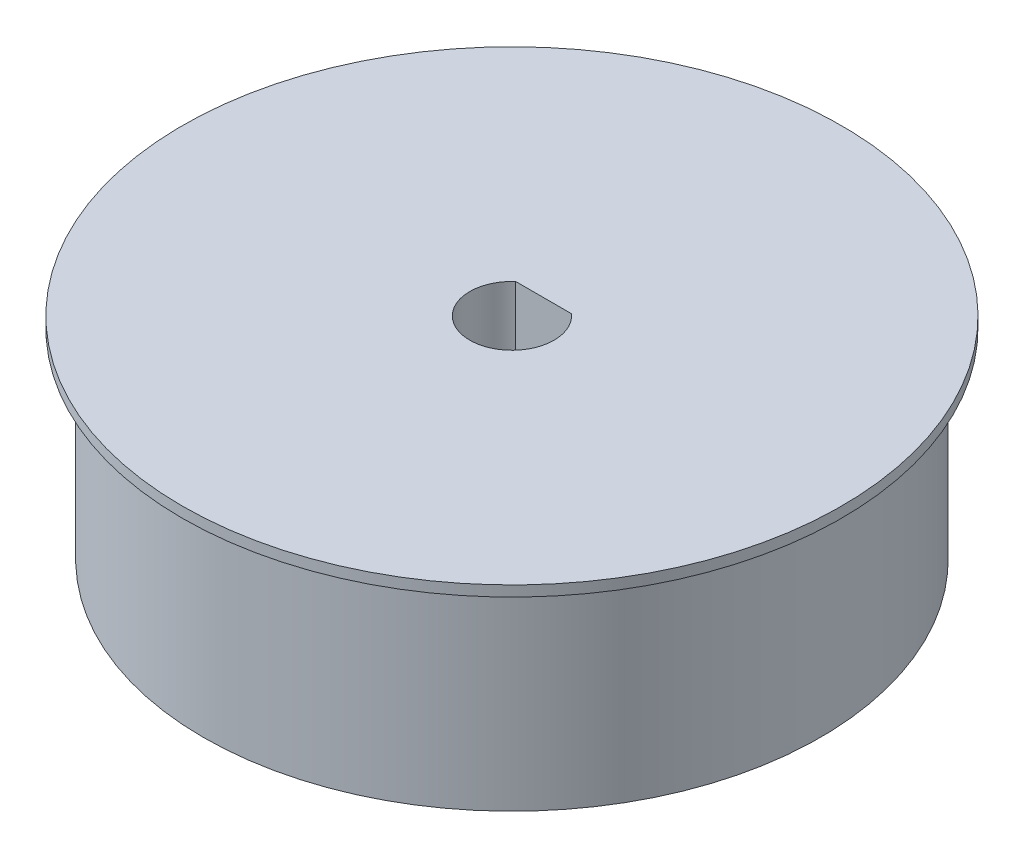
ISO-10303-21;
HEADER;
FILE_DESCRIPTION(('STEP AP214'),'2;1');
FILE_NAME('part.step','',(''),(''),'','','');
FILE_SCHEMA(('AUTOMOTIVE_DESIGN { 1 0 10303 214 1 1 1 1 }'));
ENDSEC;
DATA;
#1=APPLICATION_CONTEXT('core data for automotive mechanical design processes');
#2=APPLICATION_PROTOCOL_DEFINITION('international standard','automotive_design',2000,#1);
#3=PRODUCT_CONTEXT('',#1,'mechanical');
#4=PRODUCT('Part','Part','',(#3));
#5=PRODUCT_RELATED_PRODUCT_CATEGORY('part','',(#4));
#6=PRODUCT_DEFINITION_FORMATION('','',#4);
#7=PRODUCT_DEFINITION_CONTEXT('part definition',#1,'design');
#8=PRODUCT_DEFINITION('design','',#6,#7);
#9=PRODUCT_DEFINITION_SHAPE('','',#8);
#10=(LENGTH_UNIT() NAMED_UNIT(*) SI_UNIT(.MILLI.,.METRE.));
#11=(NAMED_UNIT(*) PLANE_ANGLE_UNIT() SI_UNIT($,.RADIAN.));
#12=(NAMED_UNIT(*) SI_UNIT($,.STERADIAN.) SOLID_ANGLE_UNIT());
#13=UNCERTAINTY_MEASURE_WITH_UNIT(LENGTH_MEASURE(1.E-05),#10,'distance_accuracy_value','');
#14=(GEOMETRIC_REPRESENTATION_CONTEXT(3) GLOBAL_UNCERTAINTY_ASSIGNED_CONTEXT((#13)) GLOBAL_UNIT_ASSIGNED_CONTEXT((#10,
#11,#12)) REPRESENTATION_CONTEXT('',''));
#15=CARTESIAN_POINT('',(0.,0.,0.));
#16=DIRECTION('',(0.,0.,1.));
#17=DIRECTION('',(1.,0.,0.));
#18=AXIS2_PLACEMENT_3D('',#15,#16,#17);
#19=CARTESIAN_POINT('',(0.,10.,0.));
#20=DIRECTION('',(0.,-1.,0.));
#21=DIRECTION('',(0.,0.,-1.));
#22=AXIS2_PLACEMENT_3D('',#19,#20,#21);
#23=CYLINDRICAL_SURFACE('',#22,14.625);
#24=CARTESIAN_POINT('',(0.,0.,0.));
#25=DIRECTION('',(0.,1.,0.));
#26=DIRECTION('',(0.,0.,1.));
#27=AXIS2_PLACEMENT_3D('',#24,#25,#26);
#28=CIRCLE('',#27,14.625);
#29=CARTESIAN_POINT('',(0.,0.,14.625));
#30=VERTEX_POINT('',#29);
#31=EDGE_CURVE('E42',#30,#30,#28,.T.);
#32=ORIENTED_EDGE('',*,*,#31,.T.);
#33=EDGE_LOOP('',(#32));
#34=FACE_BOUND('',#33,.T.);
#35=CARTESIAN_POINT('',(0.,9.5,0.));
#36=DIRECTION('',(0.,1.,0.));
#37=DIRECTION('',(0.,0.,1.));
#38=AXIS2_PLACEMENT_3D('',#35,#36,#37);
#39=CIRCLE('',#38,14.625);
#40=CARTESIAN_POINT('',(0.,9.5,14.625));
#41=VERTEX_POINT('',#40);
#42=EDGE_CURVE('E11',#41,#41,#39,.T.);
#43=ORIENTED_EDGE('',*,*,#42,.F.);
#44=EDGE_LOOP('',(#43));
#45=FACE_BOUND('',#44,.T.);
#46=ADVANCED_FACE('F39',(#34,#45),#23,.T.);
#47=CARTESIAN_POINT('',(0.,10.,0.));
#48=DIRECTION('',(0.,1.,0.));
#49=DIRECTION('',(0.,0.,1.));
#50=AXIS2_PLACEMENT_3D('',#47,#48,#49);
#51=PLANE('',#50);
#52=DIRECTION('',(-1.,0.,0.));
#53=VECTOR('',#52,1.);
#54=CARTESIAN_POINT('',(-1.3228756555323,10.,-1.5));
#55=LINE('',#54,#53);
#56=CARTESIAN_POINT('',(1.3228756555323,10.,-1.5));
#57=VERTEX_POINT('',#56);
#58=CARTESIAN_POINT('',(-1.3228756555323,10.,-1.5));
#59=VERTEX_POINT('',#58);
#60=EDGE_CURVE('E83',#57,#59,#55,.T.);
#61=ORIENTED_EDGE('',*,*,#60,.F.);
#62=CARTESIAN_POINT('',(0.,10.,0.));
#63=DIRECTION('',(0.,1.,0.));
#64=DIRECTION('',(0.,0.,1.));
#65=AXIS2_PLACEMENT_3D('',#62,#63,#64);
#66=CIRCLE('',#65,2.);
#67=EDGE_CURVE('E70',#59,#57,#66,.T.);
#68=ORIENTED_EDGE('',*,*,#67,.F.);
#69=EDGE_LOOP('',(#61,#68));
#70=FACE_BOUND('',#69,.T.);
#71=CARTESIAN_POINT('',(0.,10.,0.));
#72=DIRECTION('',(0.,1.,0.));
#73=DIRECTION('',(0.,0.,1.));
#74=AXIS2_PLACEMENT_3D('',#71,#72,#73);
#75=CIRCLE('',#74,15.625);
#76=CARTESIAN_POINT('',(0.,10.,15.625));
#77=VERTEX_POINT('',#76);
#78=EDGE_CURVE('E80',#77,#77,#75,.T.);
#79=ORIENTED_EDGE('',*,*,#78,.T.);
#80=EDGE_LOOP('',(#79));
#81=FACE_BOUND('',#80,.T.);
#82=ADVANCED_FACE('F90',(#70,#81),#51,.T.);
#83=CARTESIAN_POINT('',(0.,0.,0.));
#84=DIRECTION('',(0.,1.,0.));
#85=DIRECTION('',(0.,0.,1.));
#86=AXIS2_PLACEMENT_3D('',#83,#84,#85);
#87=PLANE('',#86);
#88=ORIENTED_EDGE('',*,*,#31,.F.);
#89=EDGE_LOOP('',(#88));
#90=FACE_BOUND('',#89,.T.);
#91=CARTESIAN_POINT('',(0.,0.,0.));
#92=DIRECTION('',(0.,1.,0.));
#93=DIRECTION('',(0.,0.,1.));
#94=AXIS2_PLACEMENT_3D('',#91,#92,#93);
#95=CIRCLE('',#94,2.);
#96=CARTESIAN_POINT('',(-1.3228756555323,0.,-1.5));
#97=VERTEX_POINT('',#96);
#98=CARTESIAN_POINT('',(1.3228756555323,0.,-1.5));
#99=VERTEX_POINT('',#98);
#100=EDGE_CURVE('E67',#97,#99,#95,.T.);
#101=ORIENTED_EDGE('',*,*,#100,.T.);
#102=DIRECTION('',(-1.,0.,0.));
#103=VECTOR('',#102,1.);
#104=CARTESIAN_POINT('',(-1.3228756555323,0.,-1.5));
#105=LINE('',#104,#103);
#106=EDGE_CURVE('E72',#99,#97,#105,.T.);
#107=ORIENTED_EDGE('',*,*,#106,.T.);
#108=EDGE_LOOP('',(#101,#107));
#109=FACE_BOUND('',#108,.T.);
#110=ADVANCED_FACE('F76',(#90,#109),#87,.F.);
#111=CARTESIAN_POINT('',(0.,10.,0.));
#112=DIRECTION('',(0.,-1.,0.));
#113=DIRECTION('',(0.,0.,-1.));
#114=AXIS2_PLACEMENT_3D('',#111,#112,#113);
#115=CYLINDRICAL_SURFACE('',#114,2.);
#116=DIRECTION('',(0.,-1.,0.));
#117=VECTOR('',#116,1.);
#118=CARTESIAN_POINT('',(1.3228756555323,10.,-1.5));
#119=LINE('',#118,#117);
#120=EDGE_CURVE('E54',#57,#99,#119,.T.);
#121=ORIENTED_EDGE('',*,*,#120,.T.);
#122=ORIENTED_EDGE('',*,*,#100,.F.);
#123=DIRECTION('',(0.,-1.,0.));
#124=VECTOR('',#123,1.);
#125=CARTESIAN_POINT('',(-1.3228756555323,10.,-1.5));
#126=LINE('',#125,#124);
#127=EDGE_CURVE('E59',#59,#97,#126,.T.);
#128=ORIENTED_EDGE('',*,*,#127,.F.);
#129=ORIENTED_EDGE('',*,*,#67,.T.);
#130=EDGE_LOOP('',(#121,#122,#128,#129));
#131=FACE_BOUND('',#130,.T.);
#132=ADVANCED_FACE('F65',(#131),#115,.F.);
#133=CARTESIAN_POINT('',(-1.3228756555323,10.,-1.5));
#134=DIRECTION('',(0.,0.,1.));
#135=DIRECTION('',(1.,0.,0.));
#136=AXIS2_PLACEMENT_3D('',#133,#134,#135);
#137=PLANE('',#136);
#138=ORIENTED_EDGE('',*,*,#127,.T.);
#139=ORIENTED_EDGE('',*,*,#106,.F.);
#140=ORIENTED_EDGE('',*,*,#120,.F.);
#141=ORIENTED_EDGE('',*,*,#60,.T.);
#142=EDGE_LOOP('',(#138,#139,#140,#141));
#143=FACE_BOUND('',#142,.T.);
#144=ADVANCED_FACE('F73',(#143),#137,.T.);
#145=CARTESIAN_POINT('',(0.,9.5,0.));
#146=DIRECTION('',(0.,1.,0.));
#147=DIRECTION('',(0.,0.,1.));
#148=AXIS2_PLACEMENT_3D('',#145,#146,#147);
#149=PLANE('',#148);
#150=CARTESIAN_POINT('',(0.,9.5,0.));
#151=DIRECTION('',(0.,1.,0.));
#152=DIRECTION('',(0.,0.,1.));
#153=AXIS2_PLACEMENT_3D('',#150,#151,#152);
#154=CIRCLE('',#153,15.625);
#155=CARTESIAN_POINT('',(0.,9.5,15.625));
#156=VERTEX_POINT('',#155);
#157=EDGE_CURVE('E77',#156,#156,#154,.T.);
#158=ORIENTED_EDGE('',*,*,#157,.F.);
#159=EDGE_LOOP('',(#158));
#160=FACE_BOUND('',#159,.T.);
#161=ORIENTED_EDGE('',*,*,#42,.T.);
#162=EDGE_LOOP('',(#161));
#163=FACE_BOUND('',#162,.T.);
#164=ADVANCED_FACE('F94',(#160,#163),#149,.F.);
#165=CARTESIAN_POINT('',(0.,9.5,0.));
#166=DIRECTION('',(0.,1.,0.));
#167=DIRECTION('',(0.,0.,1.));
#168=AXIS2_PLACEMENT_3D('',#165,#166,#167);
#169=CYLINDRICAL_SURFACE('',#168,15.625);
#170=ORIENTED_EDGE('',*,*,#157,.T.);
#171=EDGE_LOOP('',(#170));
#172=FACE_BOUND('',#171,.T.);
#173=ORIENTED_EDGE('',*,*,#78,.F.);
#174=EDGE_LOOP('',(#173));
#175=FACE_BOUND('',#174,.T.);
#176=ADVANCED_FACE('F92',(#172,#175),#169,.T.);
#177=CLOSED_SHELL('',(#46,#82,#110,#132,#144,#164,#176));
#178=MANIFOLD_SOLID_BREP('B2',#177);
#179=ADVANCED_BREP_SHAPE_REPRESENTATION('',(#18,#178),#14);
#180=SHAPE_DEFINITION_REPRESENTATION(#9,#179);
ENDSEC;
END-ISO-10303-21;
